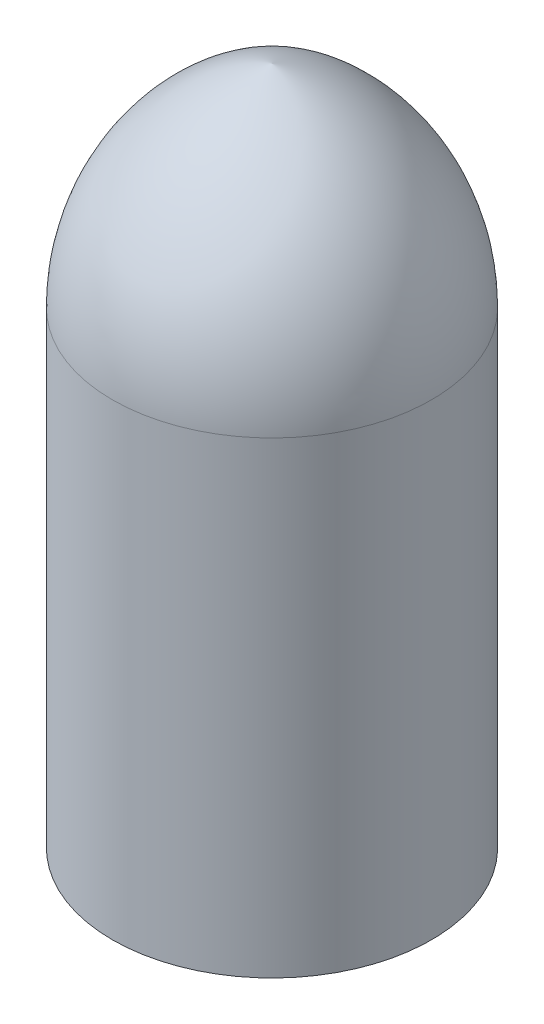
ISO-10303-21;
HEADER;
FILE_DESCRIPTION(('STEP AP214'),'2;1');
FILE_NAME('part.step','',(''),(''),'','','');
FILE_SCHEMA(('AUTOMOTIVE_DESIGN { 1 0 10303 214 1 1 1 1 }'));
ENDSEC;
DATA;
#1=APPLICATION_CONTEXT('core data for automotive mechanical design processes');
#2=APPLICATION_PROTOCOL_DEFINITION('international standard','automotive_design',2000,#1);
#3=PRODUCT_CONTEXT('',#1,'mechanical');
#4=PRODUCT('Part','Part','',(#3));
#5=PRODUCT_RELATED_PRODUCT_CATEGORY('part','',(#4));
#6=PRODUCT_DEFINITION_FORMATION('','',#4);
#7=PRODUCT_DEFINITION_CONTEXT('part definition',#1,'design');
#8=PRODUCT_DEFINITION('design','',#6,#7);
#9=PRODUCT_DEFINITION_SHAPE('','',#8);
#10=(LENGTH_UNIT() NAMED_UNIT(*) SI_UNIT(.MILLI.,.METRE.));
#11=(NAMED_UNIT(*) PLANE_ANGLE_UNIT() SI_UNIT($,.RADIAN.));
#12=(NAMED_UNIT(*) SI_UNIT($,.STERADIAN.) SOLID_ANGLE_UNIT());
#13=UNCERTAINTY_MEASURE_WITH_UNIT(LENGTH_MEASURE(1.E-05),#10,'distance_accuracy_value','');
#14=(GEOMETRIC_REPRESENTATION_CONTEXT(3) GLOBAL_UNCERTAINTY_ASSIGNED_CONTEXT((#13)) GLOBAL_UNIT_ASSIGNED_CONTEXT((#10,
#11,#12)) REPRESENTATION_CONTEXT('',''));
#15=CARTESIAN_POINT('',(0.,0.,0.));
#16=DIRECTION('',(0.,0.,1.));
#17=DIRECTION('',(1.,0.,0.));
#18=AXIS2_PLACEMENT_3D('',#15,#16,#17);
#19=CARTESIAN_POINT('',(0.,170.,21.9590163934427));
#20=DIRECTION('',(-1.,0.,0.));
#21=DIRECTION('',(0.,0.,-1.));
#22=AXIS2_PLACEMENT_3D('',#19,#20,#21);
#23=CIRCLE('',#22,78.9590163934427);
#24=TRIMMED_CURVE('',#23,(PARAMETER_VALUE(-1.28897403844099)),
(PARAMETER_VALUE(1.28897403844099)),.T.,.PARAMETER.);
#25=CARTESIAN_POINT('',(0.,170.,0.));
#26=DIRECTION('',(0.,-1.,0.));
#27=AXIS1_PLACEMENT('',#25,#26);
#28=SURFACE_OF_REVOLUTION('',#24,#27);
#29=CARTESIAN_POINT('',(0.,245.844102399939,0.));
#30=VERTEX_POINT('',#29);
#31=VERTEX_LOOP('',#30);
#32=FACE_BOUND('',#31,.T.);
#33=CARTESIAN_POINT('',(0.,170.,0.));
#34=DIRECTION('',(0.,-1.,0.));
#35=DIRECTION('',(0.,0.,-1.));
#36=AXIS2_PLACEMENT_3D('',#33,#34,#35);
#37=CIRCLE('',#36,57.);
#38=CARTESIAN_POINT('',(0.,170.,-57.));
#39=VERTEX_POINT('',#38);
#40=EDGE_CURVE('E11',#39,#39,#37,.T.);
#41=ORIENTED_EDGE('',*,*,#40,.T.);
#42=EDGE_LOOP('',(#41));
#43=FACE_BOUND('',#42,.T.);
#44=ADVANCED_FACE('F35',(#32,#43),#28,.F.);
#45=CARTESIAN_POINT('',(0.,240.623917371653,0.));
#46=DIRECTION('',(0.,-1.,0.));
#47=DIRECTION('',(0.,0.,-1.));
#48=AXIS2_PLACEMENT_3D('',#45,#46,#47);
#49=CYLINDRICAL_SURFACE('',#48,57.);
#50=ORIENTED_EDGE('',*,*,#40,.F.);
#51=EDGE_LOOP('',(#50));
#52=FACE_BOUND('',#51,.T.);
#53=CARTESIAN_POINT('',(0.,0.,0.));
#54=DIRECTION('',(0.,-1.,0.));
#55=DIRECTION('',(0.,0.,-1.));
#56=AXIS2_PLACEMENT_3D('',#53,#54,#55);
#57=CIRCLE('',#56,57.);
#58=CARTESIAN_POINT('',(0.,0.,-57.));
#59=VERTEX_POINT('',#58);
#60=EDGE_CURVE('E42',#59,#59,#57,.T.);
#61=ORIENTED_EDGE('',*,*,#60,.T.);
#62=EDGE_LOOP('',(#61));
#63=FACE_BOUND('',#62,.T.);
#64=ADVANCED_FACE('F64',(#52,#63),#49,.F.);
#65=CARTESIAN_POINT('',(0.,0.,0.));
#66=DIRECTION('',(0.,-1.,0.));
#67=DIRECTION('',(0.,0.,-1.));
#68=AXIS2_PLACEMENT_3D('',#65,#66,#67);
#69=PLANE('',#68);
#70=CARTESIAN_POINT('',(0.,0.,0.));
#71=DIRECTION('',(0.,-1.,0.));
#72=DIRECTION('',(0.,0.,-1.));
#73=AXIS2_PLACEMENT_3D('',#70,#71,#72);
#74=CIRCLE('',#73,58.);
#75=CARTESIAN_POINT('',(0.,0.,-58.));
#76=VERTEX_POINT('',#75);
#77=EDGE_CURVE('E57',#76,#76,#74,.T.);
#78=ORIENTED_EDGE('',*,*,#77,.T.);
#79=EDGE_LOOP('',(#78));
#80=FACE_BOUND('',#79,.T.);
#81=ORIENTED_EDGE('',*,*,#60,.F.);
#82=EDGE_LOOP('',(#81));
#83=FACE_BOUND('',#82,.T.);
#84=ADVANCED_FACE('F66',(#80,#83),#69,.T.);
#85=CARTESIAN_POINT('',(0.,240.623917371653,0.));
#86=DIRECTION('',(0.,-1.,0.));
#87=DIRECTION('',(0.,0.,-1.));
#88=AXIS2_PLACEMENT_3D('',#85,#86,#87);
#89=CYLINDRICAL_SURFACE('',#88,58.);
#90=CARTESIAN_POINT('',(0.,170.,0.));
#91=DIRECTION('',(0.,-1.,0.));
#92=DIRECTION('',(0.,0.,-1.));
#93=AXIS2_PLACEMENT_3D('',#90,#91,#92);
#94=CIRCLE('',#93,58.);
#95=CARTESIAN_POINT('',(0.,170.,-58.));
#96=VERTEX_POINT('',#95);
#97=EDGE_CURVE('E55',#96,#96,#94,.T.);
#98=ORIENTED_EDGE('',*,*,#97,.T.);
#99=EDGE_LOOP('',(#98));
#100=FACE_BOUND('',#99,.T.);
#101=ORIENTED_EDGE('',*,*,#77,.F.);
#102=EDGE_LOOP('',(#101));
#103=FACE_BOUND('',#102,.T.);
#104=ADVANCED_FACE('F51',(#100,#103),#89,.T.);
#105=CARTESIAN_POINT('',(0.,170.,21.9590163934426));
#106=DIRECTION('',(-1.,0.,0.));
#107=DIRECTION('',(0.,0.,-1.));
#108=AXIS2_PLACEMENT_3D('',#105,#106,#107);
#109=CIRCLE('',#108,79.9590163934426);
#110=TRIMMED_CURVE('',#109,(PARAMETER_VALUE(-1.29259310940795)),
(PARAMETER_VALUE(1.29259310940795)),.T.,.PARAMETER.);
#111=CARTESIAN_POINT('',(0.,170.,0.));
#112=DIRECTION('',(0.,-1.,0.));
#113=AXIS1_PLACEMENT('',#111,#112);
#114=SURFACE_OF_REVOLUTION('',#110,#113);
#115=CARTESIAN_POINT('',(0.,246.884627212723,0.));
#116=VERTEX_POINT('',#115);
#117=VERTEX_LOOP('',#116);
#118=FACE_BOUND('',#117,.T.);
#119=ORIENTED_EDGE('',*,*,#97,.F.);
#120=EDGE_LOOP('',(#119));
#121=FACE_BOUND('',#120,.T.);
#122=ADVANCED_FACE('F48',(#118,#121),#114,.T.);
#123=CLOSED_SHELL('',(#44,#64,#84,#104,#122));
#124=MANIFOLD_SOLID_BREP('B2',#123);
#125=ADVANCED_BREP_SHAPE_REPRESENTATION('',(#18,#124),#14);
#126=SHAPE_DEFINITION_REPRESENTATION(#9,#125);
ENDSEC;
END-ISO-10303-21;
